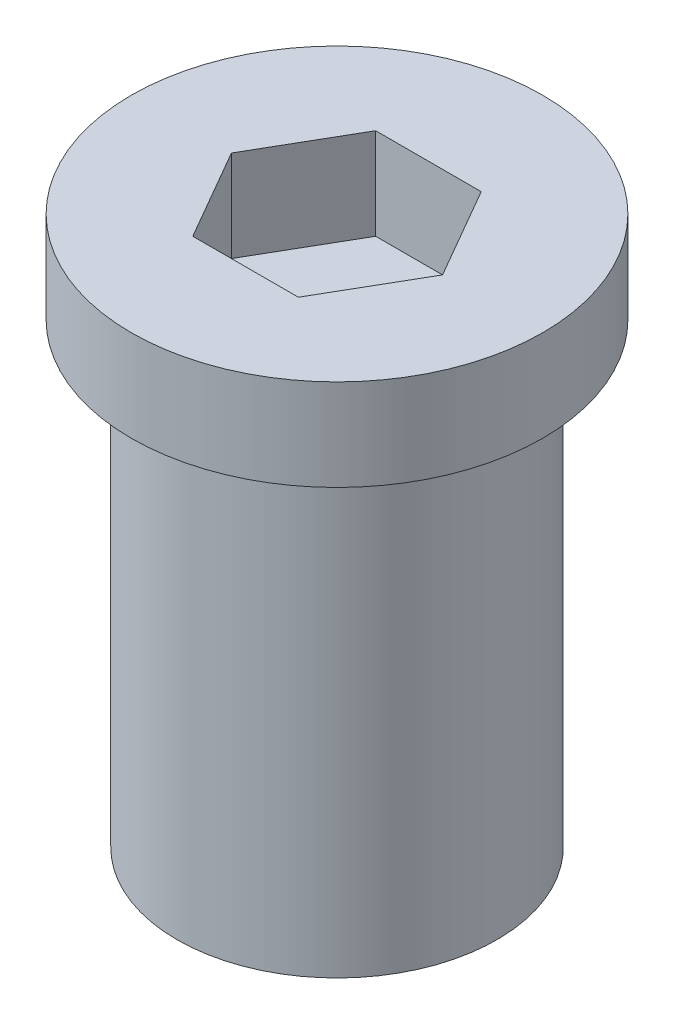
ISO-10303-21;
HEADER;
FILE_DESCRIPTION(('STEP AP214'),'2;1');
FILE_NAME('part.step','',(''),(''),'','','');
FILE_SCHEMA(('AUTOMOTIVE_DESIGN { 1 0 10303 214 1 1 1 1 }'));
ENDSEC;
DATA;
#1=APPLICATION_CONTEXT('core data for automotive mechanical design processes');
#2=APPLICATION_PROTOCOL_DEFINITION('international standard','automotive_design',2000,#1);
#3=PRODUCT_CONTEXT('',#1,'mechanical');
#4=PRODUCT('Part','Part','',(#3));
#5=PRODUCT_RELATED_PRODUCT_CATEGORY('part','',(#4));
#6=PRODUCT_DEFINITION_FORMATION('','',#4);
#7=PRODUCT_DEFINITION_CONTEXT('part definition',#1,'design');
#8=PRODUCT_DEFINITION('design','',#6,#7);
#9=PRODUCT_DEFINITION_SHAPE('','',#8);
#10=(LENGTH_UNIT() NAMED_UNIT(*) SI_UNIT(.MILLI.,.METRE.));
#11=(NAMED_UNIT(*) PLANE_ANGLE_UNIT() SI_UNIT($,.RADIAN.));
#12=(NAMED_UNIT(*) SI_UNIT($,.STERADIAN.) SOLID_ANGLE_UNIT());
#13=UNCERTAINTY_MEASURE_WITH_UNIT(LENGTH_MEASURE(1.E-05),#10,'distance_accuracy_value','');
#14=(GEOMETRIC_REPRESENTATION_CONTEXT(3) GLOBAL_UNCERTAINTY_ASSIGNED_CONTEXT((#13)) GLOBAL_UNIT_ASSIGNED_CONTEXT((#10,
#11,#12)) REPRESENTATION_CONTEXT('',''));
#15=CARTESIAN_POINT('',(0.,0.,0.));
#16=DIRECTION('',(0.,0.,1.));
#17=DIRECTION('',(1.,0.,0.));
#18=AXIS2_PLACEMENT_3D('',#15,#16,#17);
#19=CARTESIAN_POINT('',(0.,2.5,0.));
#20=DIRECTION('',(0.,-1.,0.));
#21=DIRECTION('',(0.,0.,-1.));
#22=AXIS2_PLACEMENT_3D('',#19,#20,#21);
#23=CYLINDRICAL_SURFACE('',#22,1.75);
#24=CARTESIAN_POINT('',(0.,2.5,0.));
#25=DIRECTION('',(0.,1.,0.));
#26=DIRECTION('',(0.,0.,1.));
#27=AXIS2_PLACEMENT_3D('',#24,#25,#26);
#28=CIRCLE('',#27,1.75);
#29=CARTESIAN_POINT('',(0.,2.5,1.75));
#30=VERTEX_POINT('',#29);
#31=EDGE_CURVE('E11',#30,#30,#28,.T.);
#32=ORIENTED_EDGE('',*,*,#31,.F.);
#33=EDGE_LOOP('',(#32));
#34=FACE_BOUND('',#33,.T.);
#35=CARTESIAN_POINT('',(0.,-2.5,0.));
#36=DIRECTION('',(0.,1.,0.));
#37=DIRECTION('',(0.,0.,1.));
#38=AXIS2_PLACEMENT_3D('',#35,#36,#37);
#39=CIRCLE('',#38,1.75);
#40=CARTESIAN_POINT('',(0.,-2.5,1.75));
#41=VERTEX_POINT('',#40);
#42=EDGE_CURVE('E44',#41,#41,#39,.T.);
#43=ORIENTED_EDGE('',*,*,#42,.T.);
#44=EDGE_LOOP('',(#43));
#45=FACE_BOUND('',#44,.T.);
#46=ADVANCED_FACE('F41',(#34,#45),#23,.T.);
#47=CARTESIAN_POINT('',(0.,-2.5,0.));
#48=DIRECTION('',(0.,1.,0.));
#49=DIRECTION('',(0.,0.,1.));
#50=AXIS2_PLACEMENT_3D('',#47,#48,#49);
#51=PLANE('',#50);
#52=ORIENTED_EDGE('',*,*,#42,.F.);
#53=EDGE_LOOP('',(#52));
#54=FACE_BOUND('',#53,.T.);
#55=ADVANCED_FACE('F173',(#54),#51,.F.);
#56=CARTESIAN_POINT('',(0.,3.5,0.));
#57=DIRECTION('',(0.,-1.,0.));
#58=DIRECTION('',(0.,0.,-1.));
#59=AXIS2_PLACEMENT_3D('',#56,#57,#58);
#60=CYLINDRICAL_SURFACE('',#59,2.25);
#61=CARTESIAN_POINT('',(0.,3.5,0.));
#62=DIRECTION('',(0.,1.,0.));
#63=DIRECTION('',(0.,0.,1.));
#64=AXIS2_PLACEMENT_3D('',#61,#62,#63);
#65=CIRCLE('',#64,2.25);
#66=CARTESIAN_POINT('',(0.,3.5,2.25));
#67=VERTEX_POINT('',#66);
#68=EDGE_CURVE('E148',#67,#67,#65,.T.);
#69=ORIENTED_EDGE('',*,*,#68,.F.);
#70=EDGE_LOOP('',(#69));
#71=FACE_BOUND('',#70,.T.);
#72=CARTESIAN_POINT('',(0.,2.5,0.));
#73=DIRECTION('',(0.,1.,0.));
#74=DIRECTION('',(0.,0.,1.));
#75=AXIS2_PLACEMENT_3D('',#72,#73,#74);
#76=CIRCLE('',#75,2.25);
#77=CARTESIAN_POINT('',(0.,2.5,2.25));
#78=VERTEX_POINT('',#77);
#79=EDGE_CURVE('E142',#78,#78,#76,.T.);
#80=ORIENTED_EDGE('',*,*,#79,.T.);
#81=EDGE_LOOP('',(#80));
#82=FACE_BOUND('',#81,.T.);
#83=ADVANCED_FACE('F154',(#71,#82),#60,.T.);
#84=CARTESIAN_POINT('',(0.,3.5,0.));
#85=DIRECTION('',(0.,1.,0.));
#86=DIRECTION('',(0.,0.,1.));
#87=AXIS2_PLACEMENT_3D('',#84,#85,#86);
#88=PLANE('',#87);
#89=DIRECTION('',(0.50000000870998,0.,-0.86602539875573));
#90=VECTOR('',#89,1.);
#91=CARTESIAN_POINT('',(0.577350265837154,3.5,0.999999994193348));
#92=LINE('',#91,#90);
#93=CARTESIAN_POINT('',(0.577350265837154,3.5,0.999999994193348));
#94=VERTEX_POINT('',#93);
#95=CARTESIAN_POINT('',(1.1547005450842,3.5,0.));
#96=VERTEX_POINT('',#95);
#97=EDGE_CURVE('E55',#94,#96,#92,.T.);
#98=ORIENTED_EDGE('',*,*,#97,.F.);
#99=DIRECTION('',(1.,0.,-1.00574180352141E-08));
#100=VECTOR('',#99,1.);
#101=CARTESIAN_POINT('',(-0.577350272542098,3.5,1.00000000580665));
#102=LINE('',#101,#100);
#103=CARTESIAN_POINT('',(-0.577350272542098,3.5,1.00000000580665));
#104=VERTEX_POINT('',#103);
#105=EDGE_CURVE('E138',#104,#94,#102,.T.);
#106=ORIENTED_EDGE('',*,*,#105,.F.);
#107=DIRECTION('',(0.499999991290021,0.,0.866025408813147));
#108=VECTOR('',#107,1.);
#109=CARTESIAN_POINT('',(-1.15470053167431,3.5,0.));
#110=LINE('',#109,#108);
#111=CARTESIAN_POINT('',(-1.15470053167431,3.5,0.));
#112=VERTEX_POINT('',#111);
#113=EDGE_CURVE('E136',#112,#104,#110,.T.);
#114=ORIENTED_EDGE('',*,*,#113,.F.);
#115=DIRECTION('',(-0.49999999129002,0.,0.866025408813148));
#116=VECTOR('',#115,1.);
#117=CARTESIAN_POINT('',(-0.577350272542098,3.5,-1.00000000580665));
#118=LINE('',#117,#116);
#119=CARTESIAN_POINT('',(-0.577350272542098,3.5,-1.00000000580665));
#120=VERTEX_POINT('',#119);
#121=EDGE_CURVE('E103',#120,#112,#118,.T.);
#122=ORIENTED_EDGE('',*,*,#121,.F.);
#123=DIRECTION('',(-1.,0.,-1.00574193497394E-08));
#124=VECTOR('',#123,1.);
#125=CARTESIAN_POINT('',(0.577350265837154,3.5,-0.999999994193347));
#126=LINE('',#125,#124);
#127=CARTESIAN_POINT('',(0.577350265837154,3.5,-0.999999994193347));
#128=VERTEX_POINT('',#127);
#129=EDGE_CURVE('E132',#128,#120,#126,.T.);
#130=ORIENTED_EDGE('',*,*,#129,.F.);
#131=DIRECTION('',(-0.50000000870998,0.,-0.866025398755729));
#132=VECTOR('',#131,1.);
#133=CARTESIAN_POINT('',(1.1547005450842,3.5,0.));
#134=LINE('',#133,#132);
#135=EDGE_CURVE('E129',#96,#128,#134,.T.);
#136=ORIENTED_EDGE('',*,*,#135,.F.);
#137=EDGE_LOOP('',(#98,#106,#114,#122,#130,#136));
#138=FACE_BOUND('',#137,.T.);
#139=ORIENTED_EDGE('',*,*,#68,.T.);
#140=EDGE_LOOP('',(#139));
#141=FACE_BOUND('',#140,.T.);
#142=ADVANCED_FACE('F159',(#138,#141),#88,.T.);
#143=CARTESIAN_POINT('',(0.,2.5,0.));
#144=DIRECTION('',(0.,1.,0.));
#145=DIRECTION('',(0.,0.,1.));
#146=AXIS2_PLACEMENT_3D('',#143,#144,#145);
#147=PLANE('',#146);
#148=ORIENTED_EDGE('',*,*,#31,.T.);
#149=EDGE_LOOP('',(#148));
#150=FACE_BOUND('',#149,.T.);
#151=ORIENTED_EDGE('',*,*,#79,.F.);
#152=EDGE_LOOP('',(#151));
#153=FACE_BOUND('',#152,.T.);
#154=ADVANCED_FACE('F156',(#150,#153),#147,.F.);
#155=CARTESIAN_POINT('',(0.577350265837154,2.5,0.999999994193348));
#156=DIRECTION('',(0.86602539875573,0.,0.50000000870998));
#157=DIRECTION('',(0.50000000870998,0.,-0.86602539875573));
#158=AXIS2_PLACEMENT_3D('',#155,#156,#157);
#159=PLANE('',#158);
#160=ORIENTED_EDGE('',*,*,#97,.T.);
#161=DIRECTION('',(0.,1.,0.));
#162=VECTOR('',#161,1.);
#163=CARTESIAN_POINT('',(1.1547005450842,2.5,0.));
#164=LINE('',#163,#162);
#165=CARTESIAN_POINT('',(1.1547005450842,2.5,0.));
#166=VERTEX_POINT('',#165);
#167=EDGE_CURVE('E85',#166,#96,#164,.T.);
#168=ORIENTED_EDGE('',*,*,#167,.F.);
#169=DIRECTION('',(0.50000000870998,0.,-0.86602539875573));
#170=VECTOR('',#169,1.);
#171=CARTESIAN_POINT('',(0.577350265837154,2.5,0.999999994193348));
#172=LINE('',#171,#170);
#173=CARTESIAN_POINT('',(0.577350265837154,2.5,0.999999994193348));
#174=VERTEX_POINT('',#173);
#175=EDGE_CURVE('E140',#174,#166,#172,.T.);
#176=ORIENTED_EDGE('',*,*,#175,.F.);
#177=DIRECTION('',(0.,1.,0.));
#178=VECTOR('',#177,1.);
#179=CARTESIAN_POINT('',(0.577350265837154,2.5,0.999999994193348));
#180=LINE('',#179,#178);
#181=EDGE_CURVE('E63',#174,#94,#180,.T.);
#182=ORIENTED_EDGE('',*,*,#181,.T.);
#183=EDGE_LOOP('',(#160,#168,#176,#182));
#184=FACE_BOUND('',#183,.T.);
#185=ADVANCED_FACE('F158',(#184),#159,.F.);
#186=CARTESIAN_POINT('',(-0.577350272542098,2.5,1.00000000580665));
#187=DIRECTION('',(1.00574180352141E-08,0.,1.));
#188=DIRECTION('',(1.,0.,-1.00574180352141E-08));
#189=AXIS2_PLACEMENT_3D('',#186,#187,#188);
#190=PLANE('',#189);
#191=ORIENTED_EDGE('',*,*,#105,.T.);
#192=ORIENTED_EDGE('',*,*,#181,.F.);
#193=DIRECTION('',(1.,0.,-1.00574180352141E-08));
#194=VECTOR('',#193,1.);
#195=CARTESIAN_POINT('',(-0.577350272542098,2.5,1.00000000580665));
#196=LINE('',#195,#194);
#197=CARTESIAN_POINT('',(-0.577350272542098,2.5,1.00000000580665));
#198=VERTEX_POINT('',#197);
#199=EDGE_CURVE('E115',#198,#174,#196,.T.);
#200=ORIENTED_EDGE('',*,*,#199,.F.);
#201=DIRECTION('',(0.,1.,0.));
#202=VECTOR('',#201,1.);
#203=CARTESIAN_POINT('',(-0.577350272542098,2.5,1.00000000580665));
#204=LINE('',#203,#202);
#205=EDGE_CURVE('E107',#198,#104,#204,.T.);
#206=ORIENTED_EDGE('',*,*,#205,.T.);
#207=EDGE_LOOP('',(#191,#192,#200,#206));
#208=FACE_BOUND('',#207,.T.);
#209=ADVANCED_FACE('F167',(#208),#190,.F.);
#210=CARTESIAN_POINT('',(-1.15470053167431,2.5,0.));
#211=DIRECTION('',(-0.866025408813147,0.,0.499999991290021));
#212=DIRECTION('',(0.499999991290021,0.,0.866025408813147));
#213=AXIS2_PLACEMENT_3D('',#210,#211,#212);
#214=PLANE('',#213);
#215=ORIENTED_EDGE('',*,*,#113,.T.);
#216=ORIENTED_EDGE('',*,*,#205,.F.);
#217=DIRECTION('',(0.499999991290021,0.,0.866025408813147));
#218=VECTOR('',#217,1.);
#219=CARTESIAN_POINT('',(-1.15470053167431,2.5,0.));
#220=LINE('',#219,#218);
#221=CARTESIAN_POINT('',(-1.15470053167431,2.5,0.));
#222=VERTEX_POINT('',#221);
#223=EDGE_CURVE('E111',#222,#198,#220,.T.);
#224=ORIENTED_EDGE('',*,*,#223,.F.);
#225=DIRECTION('',(0.,1.,0.));
#226=VECTOR('',#225,1.);
#227=CARTESIAN_POINT('',(-1.15470053167431,2.5,0.));
#228=LINE('',#227,#226);
#229=EDGE_CURVE('E96',#222,#112,#228,.T.);
#230=ORIENTED_EDGE('',*,*,#229,.T.);
#231=EDGE_LOOP('',(#215,#216,#224,#230));
#232=FACE_BOUND('',#231,.T.);
#233=ADVANCED_FACE('F112',(#232),#214,.F.);
#234=CARTESIAN_POINT('',(-0.577350272542098,2.5,-1.00000000580665));
#235=DIRECTION('',(-0.866025408813148,0.,-0.49999999129002));
#236=DIRECTION('',(-0.49999999129002,0.,0.866025408813148));
#237=AXIS2_PLACEMENT_3D('',#234,#235,#236);
#238=PLANE('',#237);
#239=ORIENTED_EDGE('',*,*,#121,.T.);
#240=ORIENTED_EDGE('',*,*,#229,.F.);
#241=DIRECTION('',(-0.49999999129002,0.,0.866025408813148));
#242=VECTOR('',#241,1.);
#243=CARTESIAN_POINT('',(-0.577350272542098,2.5,-1.00000000580665));
#244=LINE('',#243,#242);
#245=CARTESIAN_POINT('',(-0.577350272542098,2.5,-1.00000000580665));
#246=VERTEX_POINT('',#245);
#247=EDGE_CURVE('E100',#246,#222,#244,.T.);
#248=ORIENTED_EDGE('',*,*,#247,.F.);
#249=DIRECTION('',(0.,1.,0.));
#250=VECTOR('',#249,1.);
#251=CARTESIAN_POINT('',(-0.577350272542098,2.5,-1.00000000580665));
#252=LINE('',#251,#250);
#253=EDGE_CURVE('E108',#246,#120,#252,.T.);
#254=ORIENTED_EDGE('',*,*,#253,.T.);
#255=EDGE_LOOP('',(#239,#240,#248,#254));
#256=FACE_BOUND('',#255,.T.);
#257=ADVANCED_FACE('F98',(#256),#238,.F.);
#258=CARTESIAN_POINT('',(0.577350265837154,2.5,-0.999999994193347));
#259=DIRECTION('',(1.00574193497394E-08,0.,-1.));
#260=DIRECTION('',(-1.,0.,-1.00574193497394E-08));
#261=AXIS2_PLACEMENT_3D('',#258,#259,#260);
#262=PLANE('',#261);
#263=ORIENTED_EDGE('',*,*,#129,.T.);
#264=ORIENTED_EDGE('',*,*,#253,.F.);
#265=DIRECTION('',(-1.,0.,-1.00574193497394E-08));
#266=VECTOR('',#265,1.);
#267=CARTESIAN_POINT('',(0.577350265837154,2.5,-0.999999994193347));
#268=LINE('',#267,#266);
#269=CARTESIAN_POINT('',(0.577350265837154,2.5,-0.999999994193347));
#270=VERTEX_POINT('',#269);
#271=EDGE_CURVE('E121',#270,#246,#268,.T.);
#272=ORIENTED_EDGE('',*,*,#271,.F.);
#273=DIRECTION('',(0.,1.,0.));
#274=VECTOR('',#273,1.);
#275=CARTESIAN_POINT('',(0.577350265837154,2.5,-0.999999994193347));
#276=LINE('',#275,#274);
#277=EDGE_CURVE('E145',#270,#128,#276,.T.);
#278=ORIENTED_EDGE('',*,*,#277,.T.);
#279=EDGE_LOOP('',(#263,#264,#272,#278));
#280=FACE_BOUND('',#279,.T.);
#281=ADVANCED_FACE('F235',(#280),#262,.F.);
#282=CARTESIAN_POINT('',(1.1547005450842,2.5,0.));
#283=DIRECTION('',(0.866025398755729,0.,-0.50000000870998));
#284=DIRECTION('',(-0.50000000870998,0.,-0.866025398755729));
#285=AXIS2_PLACEMENT_3D('',#282,#283,#284);
#286=PLANE('',#285);
#287=ORIENTED_EDGE('',*,*,#135,.T.);
#288=ORIENTED_EDGE('',*,*,#277,.F.);
#289=DIRECTION('',(-0.50000000870998,0.,-0.866025398755729));
#290=VECTOR('',#289,1.);
#291=CARTESIAN_POINT('',(1.1547005450842,2.5,0.));
#292=LINE('',#291,#290);
#293=EDGE_CURVE('E123',#166,#270,#292,.T.);
#294=ORIENTED_EDGE('',*,*,#293,.F.);
#295=ORIENTED_EDGE('',*,*,#167,.T.);
#296=EDGE_LOOP('',(#287,#288,#294,#295));
#297=FACE_BOUND('',#296,.T.);
#298=ADVANCED_FACE('F244',(#297),#286,.F.);
#299=CARTESIAN_POINT('',(0.,2.5,0.));
#300=DIRECTION('',(0.,1.,0.));
#301=DIRECTION('',(0.,0.,1.));
#302=AXIS2_PLACEMENT_3D('',#299,#300,#301);
#303=PLANE('',#302);
#304=ORIENTED_EDGE('',*,*,#175,.T.);
#305=ORIENTED_EDGE('',*,*,#293,.T.);
#306=ORIENTED_EDGE('',*,*,#271,.T.);
#307=ORIENTED_EDGE('',*,*,#247,.T.);
#308=ORIENTED_EDGE('',*,*,#223,.T.);
#309=ORIENTED_EDGE('',*,*,#199,.T.);
#310=EDGE_LOOP('',(#304,#305,#306,#307,#308,#309));
#311=FACE_BOUND('',#310,.T.);
#312=ADVANCED_FACE('F118',(#311),#303,.T.);
#313=CLOSED_SHELL('',(#46,#55,#83,#142,#154,#185,#209,#233,#257,#281,#298,#312));
#314=MANIFOLD_SOLID_BREP('B2',#313);
#315=ADVANCED_BREP_SHAPE_REPRESENTATION('',(#18,#314),#14);
#316=SHAPE_DEFINITION_REPRESENTATION(#9,#315);
ENDSEC;
END-ISO-10303-21;
